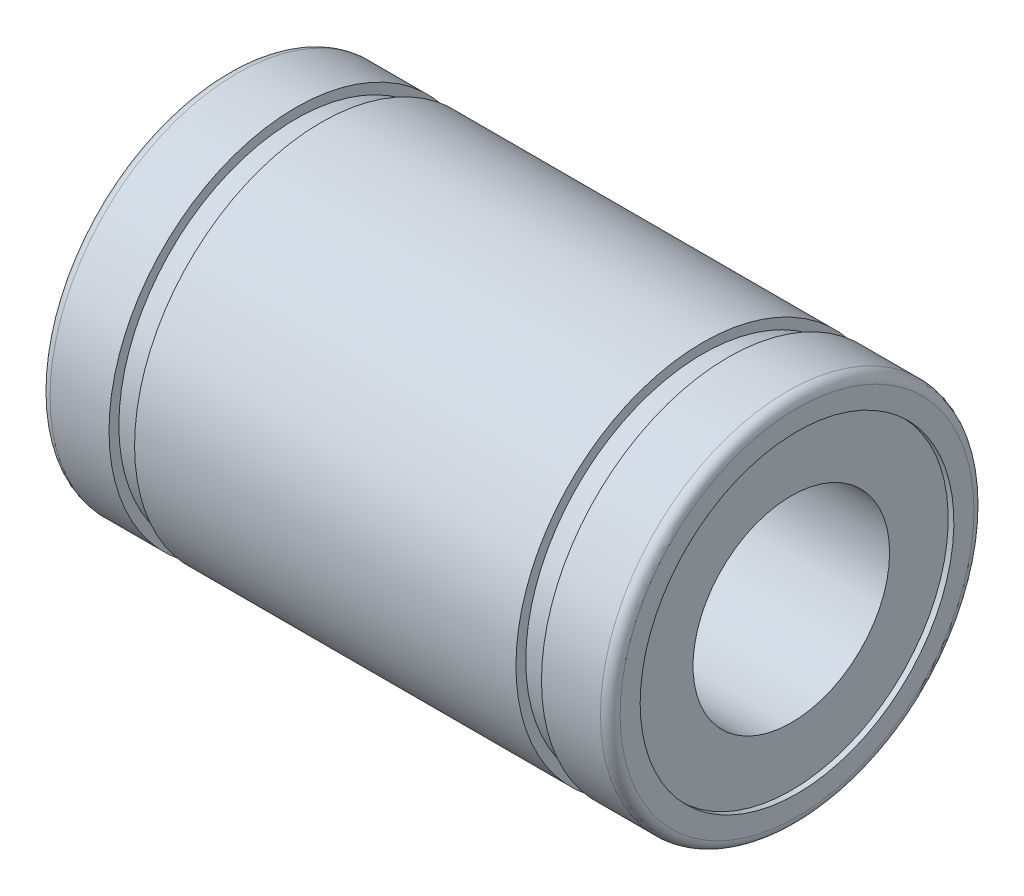
ISO-10303-21;
HEADER;
FILE_DESCRIPTION(('STEP AP214'),'2;1');
FILE_NAME('part.step','',(''),(''),'','','');
FILE_SCHEMA(('AUTOMOTIVE_DESIGN { 1 0 10303 214 1 1 1 1 }'));
ENDSEC;
DATA;
#1=APPLICATION_CONTEXT('core data for automotive mechanical design processes');
#2=APPLICATION_PROTOCOL_DEFINITION('international standard','automotive_design',2000,#1);
#3=PRODUCT_CONTEXT('',#1,'mechanical');
#4=PRODUCT('Part','Part','',(#3));
#5=PRODUCT_RELATED_PRODUCT_CATEGORY('part','',(#4));
#6=PRODUCT_DEFINITION_FORMATION('','',#4);
#7=PRODUCT_DEFINITION_CONTEXT('part definition',#1,'design');
#8=PRODUCT_DEFINITION('design','',#6,#7);
#9=PRODUCT_DEFINITION_SHAPE('','',#8);
#10=(LENGTH_UNIT() NAMED_UNIT(*) SI_UNIT(.MILLI.,.METRE.));
#11=(NAMED_UNIT(*) PLANE_ANGLE_UNIT() SI_UNIT($,.RADIAN.));
#12=(NAMED_UNIT(*) SI_UNIT($,.STERADIAN.) SOLID_ANGLE_UNIT());
#13=UNCERTAINTY_MEASURE_WITH_UNIT(LENGTH_MEASURE(1.E-05),#10,'distance_accuracy_value','');
#14=(GEOMETRIC_REPRESENTATION_CONTEXT(3) GLOBAL_UNCERTAINTY_ASSIGNED_CONTEXT((#13)) GLOBAL_UNIT_ASSIGNED_CONTEXT((#10,
#11,#12)) REPRESENTATION_CONTEXT('',''));
#15=CARTESIAN_POINT('',(0.,0.,0.));
#16=DIRECTION('',(0.,0.,1.));
#17=DIRECTION('',(1.,0.,0.));
#18=AXIS2_PLACEMENT_3D('',#15,#16,#17);
#19=CARTESIAN_POINT('',(-14.,0.,0.));
#20=DIRECTION('',(-1.,0.,0.));
#21=DIRECTION('',(0.,0.,1.));
#22=AXIS2_PLACEMENT_3D('',#19,#20,#21);
#23=TOROIDAL_SURFACE('',#22,9.,0.5);
#24=CARTESIAN_POINT('',(-14.5,0.,0.));
#25=DIRECTION('',(-1.,0.,0.));
#26=DIRECTION('',(0.,0.,1.));
#27=AXIS2_PLACEMENT_3D('',#24,#25,#26);
#28=CIRCLE('',#27,9.);
#29=CARTESIAN_POINT('',(-14.5,0.,9.));
#30=VERTEX_POINT('',#29);
#31=EDGE_CURVE('E9',#30,#30,#28,.T.);
#32=ORIENTED_EDGE('',*,*,#31,.F.);
#33=EDGE_LOOP('',(#32));
#34=FACE_BOUND('',#33,.T.);
#35=CARTESIAN_POINT('',(-14.,0.,0.));
#36=DIRECTION('',(-1.,0.,0.));
#37=DIRECTION('',(0.,0.,1.));
#38=AXIS2_PLACEMENT_3D('',#35,#36,#37);
#39=CIRCLE('',#38,9.5);
#40=CARTESIAN_POINT('',(-14.,0.,9.5));
#41=VERTEX_POINT('',#40);
#42=EDGE_CURVE('E38',#41,#41,#39,.T.);
#43=ORIENTED_EDGE('',*,*,#42,.T.);
#44=EDGE_LOOP('',(#43));
#45=FACE_BOUND('',#44,.T.);
#46=ADVANCED_FACE('F13',(#34,#45),#23,.T.);
#47=CARTESIAN_POINT('',(-14.5,9.,0.));
#48=DIRECTION('',(1.,0.,0.));
#49=DIRECTION('',(0.,0.,-1.));
#50=AXIS2_PLACEMENT_3D('',#47,#48,#49);
#51=PLANE('',#50);
#52=CARTESIAN_POINT('',(-14.5,0.,0.));
#53=DIRECTION('',(1.,0.,0.));
#54=DIRECTION('',(0.,0.,-1.));
#55=AXIS2_PLACEMENT_3D('',#52,#53,#54);
#56=CIRCLE('',#55,7.98);
#57=CARTESIAN_POINT('',(-14.5,0.,-7.98));
#58=VERTEX_POINT('',#57);
#59=EDGE_CURVE('E39',#58,#58,#56,.T.);
#60=ORIENTED_EDGE('',*,*,#59,.T.);
#61=EDGE_LOOP('',(#60));
#62=FACE_BOUND('',#61,.T.);
#63=ORIENTED_EDGE('',*,*,#31,.T.);
#64=EDGE_LOOP('',(#63));
#65=FACE_BOUND('',#64,.T.);
#66=ADVANCED_FACE('F107',(#62,#65),#51,.F.);
#67=CARTESIAN_POINT('',(14.5,0.,0.));
#68=DIRECTION('',(-1.,0.,0.));
#69=DIRECTION('',(0.,0.,1.));
#70=AXIS2_PLACEMENT_3D('',#67,#68,#69);
#71=PLANE('',#70);
#72=CARTESIAN_POINT('',(14.5,0.,0.));
#73=DIRECTION('',(-1.,0.,0.));
#74=DIRECTION('',(0.,0.,1.));
#75=AXIS2_PLACEMENT_3D('',#72,#73,#74);
#76=CIRCLE('',#75,7.98);
#77=CARTESIAN_POINT('',(14.5,0.,7.98));
#78=VERTEX_POINT('',#77);
#79=EDGE_CURVE('E35',#78,#78,#76,.T.);
#80=ORIENTED_EDGE('',*,*,#79,.T.);
#81=EDGE_LOOP('',(#80));
#82=FACE_BOUND('',#81,.T.);
#83=CARTESIAN_POINT('',(14.5,0.,0.));
#84=DIRECTION('',(-1.,0.,0.));
#85=DIRECTION('',(0.,0.,1.));
#86=AXIS2_PLACEMENT_3D('',#83,#84,#85);
#87=CIRCLE('',#86,9.);
#88=CARTESIAN_POINT('',(14.5,0.,9.));
#89=VERTEX_POINT('',#88);
#90=EDGE_CURVE('E21',#89,#89,#87,.T.);
#91=ORIENTED_EDGE('',*,*,#90,.F.);
#92=EDGE_LOOP('',(#91));
#93=FACE_BOUND('',#92,.T.);
#94=ADVANCED_FACE('F102',(#82,#93),#71,.F.);
#95=CARTESIAN_POINT('',(14.,0.,0.));
#96=DIRECTION('',(-1.,0.,0.));
#97=DIRECTION('',(0.,0.,1.));
#98=AXIS2_PLACEMENT_3D('',#95,#96,#97);
#99=TOROIDAL_SURFACE('',#98,9.,0.5);
#100=CARTESIAN_POINT('',(14.,0.,0.));
#101=DIRECTION('',(-1.,0.,0.));
#102=DIRECTION('',(0.,0.,1.));
#103=AXIS2_PLACEMENT_3D('',#100,#101,#102);
#104=CIRCLE('',#103,9.5);
#105=CARTESIAN_POINT('',(14.,0.,9.5));
#106=VERTEX_POINT('',#105);
#107=EDGE_CURVE('E31',#106,#106,#104,.T.);
#108=ORIENTED_EDGE('',*,*,#107,.F.);
#109=EDGE_LOOP('',(#108));
#110=FACE_BOUND('',#109,.T.);
#111=ORIENTED_EDGE('',*,*,#90,.T.);
#112=EDGE_LOOP('',(#111));
#113=FACE_BOUND('',#112,.T.);
#114=ADVANCED_FACE('F99',(#110,#113),#99,.T.);
#115=CARTESIAN_POINT('',(0.,0.,0.));
#116=DIRECTION('',(-1.,0.,0.));
#117=DIRECTION('',(0.,0.,1.));
#118=AXIS2_PLACEMENT_3D('',#115,#116,#117);
#119=CYLINDRICAL_SURFACE('',#118,9.5);
#120=CARTESIAN_POINT('',(11.,0.,0.));
#121=DIRECTION('',(-1.,0.,0.));
#122=DIRECTION('',(0.,0.,1.));
#123=AXIS2_PLACEMENT_3D('',#120,#121,#122);
#124=CIRCLE('',#123,9.5);
#125=CARTESIAN_POINT('',(11.,0.,9.5));
#126=VERTEX_POINT('',#125);
#127=EDGE_CURVE('E89',#126,#126,#124,.T.);
#128=ORIENTED_EDGE('',*,*,#127,.F.);
#129=EDGE_LOOP('',(#128));
#130=FACE_BOUND('',#129,.T.);
#131=ORIENTED_EDGE('',*,*,#107,.T.);
#132=EDGE_LOOP('',(#131));
#133=FACE_BOUND('',#132,.T.);
#134=ADVANCED_FACE('F97',(#130,#133),#119,.T.);
#135=CARTESIAN_POINT('',(11.,9.,0.));
#136=DIRECTION('',(-1.,0.,0.));
#137=DIRECTION('',(0.,0.,1.));
#138=AXIS2_PLACEMENT_3D('',#135,#136,#137);
#139=PLANE('',#138);
#140=ORIENTED_EDGE('',*,*,#127,.T.);
#141=EDGE_LOOP('',(#140));
#142=FACE_BOUND('',#141,.T.);
#143=CARTESIAN_POINT('',(11.,0.,0.));
#144=DIRECTION('',(-1.,0.,0.));
#145=DIRECTION('',(0.,0.,1.));
#146=AXIS2_PLACEMENT_3D('',#143,#144,#145);
#147=CIRCLE('',#146,9.);
#148=CARTESIAN_POINT('',(11.,0.,9.));
#149=VERTEX_POINT('',#148);
#150=EDGE_CURVE('E85',#149,#149,#147,.T.);
#151=ORIENTED_EDGE('',*,*,#150,.F.);
#152=EDGE_LOOP('',(#151));
#153=FACE_BOUND('',#152,.T.);
#154=ADVANCED_FACE('F155',(#142,#153),#139,.T.);
#155=CARTESIAN_POINT('',(0.,0.,0.));
#156=DIRECTION('',(-1.,0.,0.));
#157=DIRECTION('',(0.,0.,1.));
#158=AXIS2_PLACEMENT_3D('',#155,#156,#157);
#159=CYLINDRICAL_SURFACE('',#158,9.);
#160=ORIENTED_EDGE('',*,*,#150,.T.);
#161=EDGE_LOOP('',(#160));
#162=FACE_BOUND('',#161,.T.);
#163=CARTESIAN_POINT('',(9.7,0.,0.));
#164=DIRECTION('',(-1.,0.,0.));
#165=DIRECTION('',(0.,0.,1.));
#166=AXIS2_PLACEMENT_3D('',#163,#164,#165);
#167=CIRCLE('',#166,9.);
#168=CARTESIAN_POINT('',(9.7,0.,9.));
#169=VERTEX_POINT('',#168);
#170=EDGE_CURVE('E81',#169,#169,#167,.T.);
#171=ORIENTED_EDGE('',*,*,#170,.F.);
#172=EDGE_LOOP('',(#171));
#173=FACE_BOUND('',#172,.T.);
#174=ADVANCED_FACE('F151',(#162,#173),#159,.T.);
#175=CARTESIAN_POINT('',(9.7,9.5,0.));
#176=DIRECTION('',(1.,0.,0.));
#177=DIRECTION('',(0.,0.,-1.));
#178=AXIS2_PLACEMENT_3D('',#175,#176,#177);
#179=PLANE('',#178);
#180=ORIENTED_EDGE('',*,*,#170,.T.);
#181=EDGE_LOOP('',(#180));
#182=FACE_BOUND('',#181,.T.);
#183=CARTESIAN_POINT('',(9.7,0.,0.));
#184=DIRECTION('',(-1.,0.,0.));
#185=DIRECTION('',(0.,0.,1.));
#186=AXIS2_PLACEMENT_3D('',#183,#184,#185);
#187=CIRCLE('',#186,9.5);
#188=CARTESIAN_POINT('',(9.7,0.,9.5));
#189=VERTEX_POINT('',#188);
#190=EDGE_CURVE('E77',#189,#189,#187,.T.);
#191=ORIENTED_EDGE('',*,*,#190,.F.);
#192=EDGE_LOOP('',(#191));
#193=FACE_BOUND('',#192,.T.);
#194=ADVANCED_FACE('F147',(#182,#193),#179,.T.);
#195=CARTESIAN_POINT('',(0.,0.,0.));
#196=DIRECTION('',(-1.,0.,0.));
#197=DIRECTION('',(0.,0.,1.));
#198=AXIS2_PLACEMENT_3D('',#195,#196,#197);
#199=CYLINDRICAL_SURFACE('',#198,9.5);
#200=CARTESIAN_POINT('',(-9.7,0.,0.));
#201=DIRECTION('',(-1.,0.,0.));
#202=DIRECTION('',(0.,0.,1.));
#203=AXIS2_PLACEMENT_3D('',#200,#201,#202);
#204=CIRCLE('',#203,9.5);
#205=CARTESIAN_POINT('',(-9.7,0.,9.5));
#206=VERTEX_POINT('',#205);
#207=EDGE_CURVE('E73',#206,#206,#204,.T.);
#208=ORIENTED_EDGE('',*,*,#207,.F.);
#209=EDGE_LOOP('',(#208));
#210=FACE_BOUND('',#209,.T.);
#211=ORIENTED_EDGE('',*,*,#190,.T.);
#212=EDGE_LOOP('',(#211));
#213=FACE_BOUND('',#212,.T.);
#214=ADVANCED_FACE('F143',(#210,#213),#199,.T.);
#215=CARTESIAN_POINT('',(-9.7,9.,0.));
#216=DIRECTION('',(-1.,0.,0.));
#217=DIRECTION('',(0.,0.,1.));
#218=AXIS2_PLACEMENT_3D('',#215,#216,#217);
#219=PLANE('',#218);
#220=ORIENTED_EDGE('',*,*,#207,.T.);
#221=EDGE_LOOP('',(#220));
#222=FACE_BOUND('',#221,.T.);
#223=CARTESIAN_POINT('',(-9.7,0.,0.));
#224=DIRECTION('',(-1.,0.,0.));
#225=DIRECTION('',(0.,0.,1.));
#226=AXIS2_PLACEMENT_3D('',#223,#224,#225);
#227=CIRCLE('',#226,9.);
#228=CARTESIAN_POINT('',(-9.7,0.,9.));
#229=VERTEX_POINT('',#228);
#230=EDGE_CURVE('E69',#229,#229,#227,.T.);
#231=ORIENTED_EDGE('',*,*,#230,.F.);
#232=EDGE_LOOP('',(#231));
#233=FACE_BOUND('',#232,.T.);
#234=ADVANCED_FACE('F136',(#222,#233),#219,.T.);
#235=CARTESIAN_POINT('',(0.,0.,0.));
#236=DIRECTION('',(-1.,0.,0.));
#237=DIRECTION('',(0.,0.,1.));
#238=AXIS2_PLACEMENT_3D('',#235,#236,#237);
#239=CYLINDRICAL_SURFACE('',#238,9.);
#240=ORIENTED_EDGE('',*,*,#230,.T.);
#241=EDGE_LOOP('',(#240));
#242=FACE_BOUND('',#241,.T.);
#243=CARTESIAN_POINT('',(-11.,0.,0.));
#244=DIRECTION('',(-1.,0.,0.));
#245=DIRECTION('',(0.,0.,1.));
#246=AXIS2_PLACEMENT_3D('',#243,#244,#245);
#247=CIRCLE('',#246,9.);
#248=CARTESIAN_POINT('',(-11.,0.,9.));
#249=VERTEX_POINT('',#248);
#250=EDGE_CURVE('E65',#249,#249,#247,.T.);
#251=ORIENTED_EDGE('',*,*,#250,.F.);
#252=EDGE_LOOP('',(#251));
#253=FACE_BOUND('',#252,.T.);
#254=ADVANCED_FACE('F130',(#242,#253),#239,.T.);
#255=CARTESIAN_POINT('',(-11.,9.5,0.));
#256=DIRECTION('',(1.,0.,0.));
#257=DIRECTION('',(0.,0.,-1.));
#258=AXIS2_PLACEMENT_3D('',#255,#256,#257);
#259=PLANE('',#258);
#260=ORIENTED_EDGE('',*,*,#250,.T.);
#261=EDGE_LOOP('',(#260));
#262=FACE_BOUND('',#261,.T.);
#263=CARTESIAN_POINT('',(-11.,0.,0.));
#264=DIRECTION('',(-1.,0.,0.));
#265=DIRECTION('',(0.,0.,1.));
#266=AXIS2_PLACEMENT_3D('',#263,#264,#265);
#267=CIRCLE('',#266,9.5);
#268=CARTESIAN_POINT('',(-11.,0.,9.5));
#269=VERTEX_POINT('',#268);
#270=EDGE_CURVE('E62',#269,#269,#267,.T.);
#271=ORIENTED_EDGE('',*,*,#270,.F.);
#272=EDGE_LOOP('',(#271));
#273=FACE_BOUND('',#272,.T.);
#274=ADVANCED_FACE('F125',(#262,#273),#259,.T.);
#275=CARTESIAN_POINT('',(0.,0.,0.));
#276=DIRECTION('',(-1.,0.,0.));
#277=DIRECTION('',(0.,0.,1.));
#278=AXIS2_PLACEMENT_3D('',#275,#276,#277);
#279=CYLINDRICAL_SURFACE('',#278,9.5);
#280=ORIENTED_EDGE('',*,*,#42,.F.);
#281=EDGE_LOOP('',(#280));
#282=FACE_BOUND('',#281,.T.);
#283=ORIENTED_EDGE('',*,*,#270,.T.);
#284=EDGE_LOOP('',(#283));
#285=FACE_BOUND('',#284,.T.);
#286=ADVANCED_FACE('F121',(#282,#285),#279,.T.);
#287=CARTESIAN_POINT('',(13.05,0.,0.));
#288=DIRECTION('',(1.,0.,0.));
#289=DIRECTION('',(0.,-1.,0.));
#290=AXIS2_PLACEMENT_3D('',#287,#288,#289);
#291=CYLINDRICAL_SURFACE('',#290,7.98);
#292=CARTESIAN_POINT('',(14.21,0.,0.));
#293=DIRECTION('',(-1.,0.,0.));
#294=DIRECTION('',(0.,-1.,0.));
#295=AXIS2_PLACEMENT_3D('',#292,#293,#294);
#296=CIRCLE('',#295,7.98);
#297=CARTESIAN_POINT('',(14.21,-7.98,0.));
#298=VERTEX_POINT('',#297);
#299=EDGE_CURVE('E42',#298,#298,#296,.T.);
#300=ORIENTED_EDGE('',*,*,#299,.T.);
#301=EDGE_LOOP('',(#300));
#302=FACE_BOUND('',#301,.T.);
#303=ORIENTED_EDGE('',*,*,#79,.F.);
#304=EDGE_LOOP('',(#303));
#305=FACE_BOUND('',#304,.T.);
#306=ADVANCED_FACE('F124',(#302,#305),#291,.F.);
#307=CARTESIAN_POINT('',(-13.05,0.,0.));
#308=DIRECTION('',(-1.,0.,0.));
#309=DIRECTION('',(0.,-1.,0.));
#310=AXIS2_PLACEMENT_3D('',#307,#308,#309);
#311=CYLINDRICAL_SURFACE('',#310,7.98);
#312=CARTESIAN_POINT('',(-14.21,0.,0.));
#313=DIRECTION('',(1.,0.,0.));
#314=DIRECTION('',(0.,-1.,0.));
#315=AXIS2_PLACEMENT_3D('',#312,#313,#314);
#316=CIRCLE('',#315,7.98);
#317=CARTESIAN_POINT('',(-14.21,-7.98,0.));
#318=VERTEX_POINT('',#317);
#319=EDGE_CURVE('E48',#318,#318,#316,.T.);
#320=ORIENTED_EDGE('',*,*,#319,.T.);
#321=EDGE_LOOP('',(#320));
#322=FACE_BOUND('',#321,.T.);
#323=ORIENTED_EDGE('',*,*,#59,.F.);
#324=EDGE_LOOP('',(#323));
#325=FACE_BOUND('',#324,.T.);
#326=ADVANCED_FACE('F222',(#322,#325),#311,.F.);
#327=CARTESIAN_POINT('',(14.21,0.,0.));
#328=DIRECTION('',(1.,0.,0.));
#329=DIRECTION('',(0.,0.,-1.));
#330=AXIS2_PLACEMENT_3D('',#327,#328,#329);
#331=PLANE('',#330);
#332=CARTESIAN_POINT('',(14.21,0.,0.));
#333=DIRECTION('',(1.,0.,0.));
#334=DIRECTION('',(0.,0.,-1.));
#335=AXIS2_PLACEMENT_3D('',#332,#333,#334);
#336=CIRCLE('',#335,5.);
#337=CARTESIAN_POINT('',(14.21,0.,-5.));
#338=VERTEX_POINT('',#337);
#339=EDGE_CURVE('E56',#338,#338,#336,.T.);
#340=ORIENTED_EDGE('',*,*,#339,.F.);
#341=EDGE_LOOP('',(#340));
#342=FACE_BOUND('',#341,.T.);
#343=ORIENTED_EDGE('',*,*,#299,.F.);
#344=EDGE_LOOP('',(#343));
#345=FACE_BOUND('',#344,.T.);
#346=ADVANCED_FACE('F230',(#342,#345),#331,.T.);
#347=CARTESIAN_POINT('',(-14.21,0.,0.));
#348=DIRECTION('',(-1.,0.,0.));
#349=DIRECTION('',(0.,0.,1.));
#350=AXIS2_PLACEMENT_3D('',#347,#348,#349);
#351=PLANE('',#350);
#352=CARTESIAN_POINT('',(-14.21,0.,0.));
#353=DIRECTION('',(-1.,0.,0.));
#354=DIRECTION('',(0.,0.,1.));
#355=AXIS2_PLACEMENT_3D('',#352,#353,#354);
#356=CIRCLE('',#355,5.);
#357=CARTESIAN_POINT('',(-14.21,0.,5.));
#358=VERTEX_POINT('',#357);
#359=EDGE_CURVE('E16',#358,#358,#356,.T.);
#360=ORIENTED_EDGE('',*,*,#359,.F.);
#361=EDGE_LOOP('',(#360));
#362=FACE_BOUND('',#361,.T.);
#363=ORIENTED_EDGE('',*,*,#319,.F.);
#364=EDGE_LOOP('',(#363));
#365=FACE_BOUND('',#364,.T.);
#366=ADVANCED_FACE('F240',(#362,#365),#351,.T.);
#367=CARTESIAN_POINT('',(-29.,0.,0.));
#368=DIRECTION('',(1.,0.,0.));
#369=DIRECTION('',(0.,-1.,0.));
#370=AXIS2_PLACEMENT_3D('',#367,#368,#369);
#371=CYLINDRICAL_SURFACE('',#370,5.);
#372=ORIENTED_EDGE('',*,*,#339,.T.);
#373=EDGE_LOOP('',(#372));
#374=FACE_BOUND('',#373,.T.);
#375=ORIENTED_EDGE('',*,*,#359,.T.);
#376=EDGE_LOOP('',(#375));
#377=FACE_BOUND('',#376,.T.);
#378=ADVANCED_FACE('F249',(#374,#377),#371,.F.);
#379=CLOSED_SHELL('',(#46,#66,#94,#114,#134,#154,#174,#194,#214,#234,#254,#274,#286,#306,#326,
#346,#366,#378));
#380=MANIFOLD_SOLID_BREP('B1',#379);
#381=ADVANCED_BREP_SHAPE_REPRESENTATION('',(#18,#380),#14);
#382=SHAPE_DEFINITION_REPRESENTATION(#9,#381);
ENDSEC;
END-ISO-10303-21;
